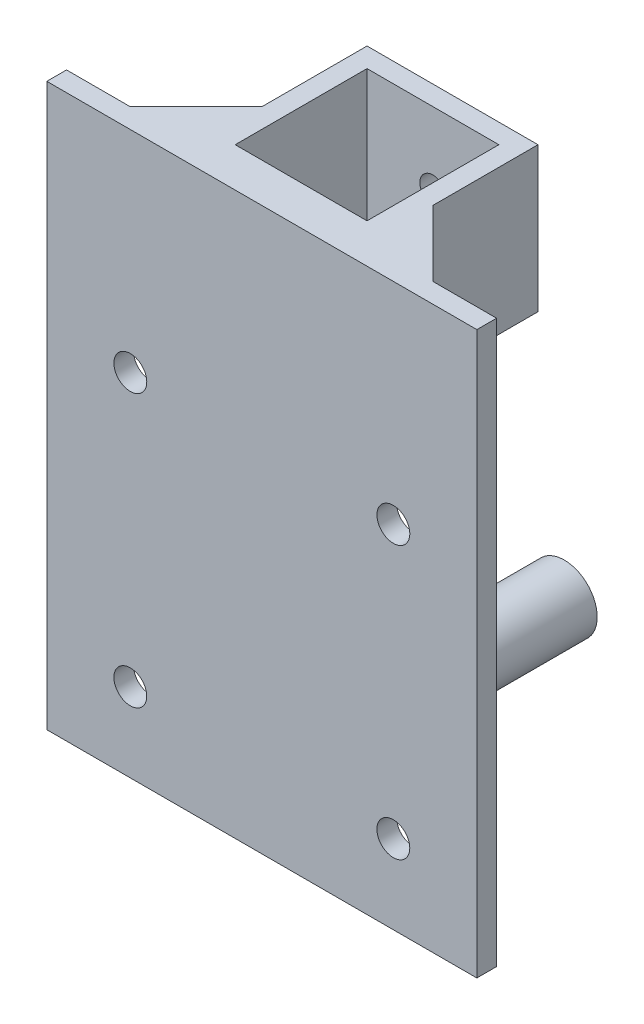
ISO-10303-21;
HEADER;
FILE_DESCRIPTION(('STEP AP214'),'2;1');
FILE_NAME('part.step','',(''),(''),'','','');
FILE_SCHEMA(('AUTOMOTIVE_DESIGN { 1 0 10303 214 1 1 1 1 }'));
ENDSEC;
DATA;
#1=APPLICATION_CONTEXT('core data for automotive mechanical design processes');
#2=APPLICATION_PROTOCOL_DEFINITION('international standard','automotive_design',2000,#1);
#3=PRODUCT_CONTEXT('',#1,'mechanical');
#4=PRODUCT('Part','Part','',(#3));
#5=PRODUCT_RELATED_PRODUCT_CATEGORY('part','',(#4));
#6=PRODUCT_DEFINITION_FORMATION('','',#4);
#7=PRODUCT_DEFINITION_CONTEXT('part definition',#1,'design');
#8=PRODUCT_DEFINITION('design','',#6,#7);
#9=PRODUCT_DEFINITION_SHAPE('','',#8);
#10=(LENGTH_UNIT() NAMED_UNIT(*) SI_UNIT(.MILLI.,.METRE.));
#11=(NAMED_UNIT(*) PLANE_ANGLE_UNIT() SI_UNIT($,.RADIAN.));
#12=(NAMED_UNIT(*) SI_UNIT($,.STERADIAN.) SOLID_ANGLE_UNIT());
#13=UNCERTAINTY_MEASURE_WITH_UNIT(LENGTH_MEASURE(1.E-05),#10,'distance_accuracy_value','');
#14=(GEOMETRIC_REPRESENTATION_CONTEXT(3) GLOBAL_UNCERTAINTY_ASSIGNED_CONTEXT((#13)) GLOBAL_UNIT_ASSIGNED_CONTEXT((#10,
#11,#12)) REPRESENTATION_CONTEXT('',''));
#15=CARTESIAN_POINT('',(0.,0.,0.));
#16=DIRECTION('',(0.,0.,1.));
#17=DIRECTION('',(1.,0.,0.));
#18=AXIS2_PLACEMENT_3D('',#15,#16,#17);
#19=CARTESIAN_POINT('',(0.,0.,0.));
#20=DIRECTION('',(0.,0.,1.));
#21=DIRECTION('',(1.,0.,0.));
#22=AXIS2_PLACEMENT_3D('',#19,#20,#21);
#23=PLANE('',#22);
#24=CARTESIAN_POINT('',(-10.7,32.7,0.));
#25=DIRECTION('',(0.,0.,1.));
#26=DIRECTION('',(1.,0.,0.));
#27=AXIS2_PLACEMENT_3D('',#24,#25,#26);
#28=CIRCLE('',#27,5.);
#29=CARTESIAN_POINT('',(-5.7,32.7,0.));
#30=VERTEX_POINT('',#29);
#31=EDGE_CURVE('E317',#30,#30,#28,.F.);
#32=ORIENTED_EDGE('',*,*,#31,.F.);
#33=EDGE_LOOP('',(#32));
#34=FACE_BOUND('',#33,.T.);
#35=CARTESIAN_POINT('',(-54.7,32.7,0.));
#36=DIRECTION('',(0.,0.,1.));
#37=DIRECTION('',(1.,0.,0.));
#38=AXIS2_PLACEMENT_3D('',#35,#36,#37);
#39=CIRCLE('',#38,5.87255145259777);
#40=CARTESIAN_POINT('',(-48.8274485474022,32.7,0.));
#41=VERTEX_POINT('',#40);
#42=EDGE_CURVE('E313',#41,#41,#39,.F.);
#43=ORIENTED_EDGE('',*,*,#42,.F.);
#44=EDGE_LOOP('',(#43));
#45=FACE_BOUND('',#44,.T.);
#46=CARTESIAN_POINT('',(-52.7,12.,0.));
#47=DIRECTION('',(0.,0.,1.));
#48=DIRECTION('',(-1.,0.,0.));
#49=AXIS2_PLACEMENT_3D('',#46,#47,#48);
#50=CIRCLE('',#49,2.5);
#51=CARTESIAN_POINT('',(-55.2,12.,0.));
#52=VERTEX_POINT('',#51);
#53=EDGE_CURVE('E238',#52,#52,#50,.T.);
#54=ORIENTED_EDGE('',*,*,#53,.T.);
#55=EDGE_LOOP('',(#54));
#56=FACE_BOUND('',#55,.T.);
#57=CARTESIAN_POINT('',(-12.7,12.,0.));
#58=DIRECTION('',(0.,0.,1.));
#59=DIRECTION('',(1.,0.,0.));
#60=AXIS2_PLACEMENT_3D('',#57,#58,#59);
#61=CIRCLE('',#60,2.5);
#62=CARTESIAN_POINT('',(-10.2,12.,0.));
#63=VERTEX_POINT('',#62);
#64=EDGE_CURVE('E243',#63,#63,#61,.T.);
#65=ORIENTED_EDGE('',*,*,#64,.T.);
#66=EDGE_LOOP('',(#65));
#67=FACE_BOUND('',#66,.T.);
#68=CARTESIAN_POINT('',(-12.7,53.4,0.));
#69=DIRECTION('',(0.,0.,1.));
#70=DIRECTION('',(-1.,0.,0.));
#71=AXIS2_PLACEMENT_3D('',#68,#69,#70);
#72=CIRCLE('',#71,2.5);
#73=CARTESIAN_POINT('',(-15.2,53.4,0.));
#74=VERTEX_POINT('',#73);
#75=EDGE_CURVE('E251',#74,#74,#72,.T.);
#76=ORIENTED_EDGE('',*,*,#75,.T.);
#77=EDGE_LOOP('',(#76));
#78=FACE_BOUND('',#77,.T.);
#79=CARTESIAN_POINT('',(-52.7,53.4,0.));
#80=DIRECTION('',(0.,0.,1.));
#81=DIRECTION('',(1.,0.,0.));
#82=AXIS2_PLACEMENT_3D('',#79,#80,#81);
#83=CIRCLE('',#82,2.5);
#84=CARTESIAN_POINT('',(-50.2,53.4,0.));
#85=VERTEX_POINT('',#84);
#86=EDGE_CURVE('E259',#85,#85,#83,.T.);
#87=ORIENTED_EDGE('',*,*,#86,.T.);
#88=EDGE_LOOP('',(#87));
#89=FACE_BOUND('',#88,.T.);
#90=DIRECTION('',(-1.,0.,0.));
#91=VECTOR('',#90,1.);
#92=CARTESIAN_POINT('',(-19.7,63.4,0.));
#93=LINE('',#92,#91);
#94=CARTESIAN_POINT('',(-9.70000000000007,63.4,0.));
#95=VERTEX_POINT('',#94);
#96=CARTESIAN_POINT('',(-55.6999999999999,63.4,0.));
#97=VERTEX_POINT('',#96);
#98=EDGE_CURVE('E65',#95,#97,#93,.T.);
#99=ORIENTED_EDGE('',*,*,#98,.F.);
#100=DIRECTION('',(0.,1.,0.));
#101=VECTOR('',#100,1.);
#102=CARTESIAN_POINT('',(-9.70000000000007,85.4,0.));
#103=LINE('',#102,#101);
#104=CARTESIAN_POINT('',(-9.70000000000007,85.4,0.));
#105=VERTEX_POINT('',#104);
#106=EDGE_CURVE('E70',#95,#105,#103,.T.);
#107=ORIENTED_EDGE('',*,*,#106,.T.);
#108=DIRECTION('',(-1.,0.,0.));
#109=VECTOR('',#108,1.);
#110=CARTESIAN_POINT('',(0.,85.4,0.));
#111=LINE('',#110,#109);
#112=CARTESIAN_POINT('',(0.,85.4,0.));
#113=VERTEX_POINT('',#112);
#114=EDGE_CURVE('E290',#113,#105,#111,.T.);
#115=ORIENTED_EDGE('',*,*,#114,.F.);
#116=DIRECTION('',(0.,1.,0.));
#117=VECTOR('',#116,1.);
#118=CARTESIAN_POINT('',(0.,0.,0.));
#119=LINE('',#118,#117);
#120=CARTESIAN_POINT('',(0.,0.,0.));
#121=VERTEX_POINT('',#120);
#122=EDGE_CURVE('E267',#121,#113,#119,.T.);
#123=ORIENTED_EDGE('',*,*,#122,.F.);
#124=DIRECTION('',(1.,0.,0.));
#125=VECTOR('',#124,1.);
#126=CARTESIAN_POINT('',(0.,0.,0.));
#127=LINE('',#126,#125);
#128=CARTESIAN_POINT('',(-65.4,0.,0.));
#129=VERTEX_POINT('',#128);
#130=EDGE_CURVE('E276',#129,#121,#127,.T.);
#131=ORIENTED_EDGE('',*,*,#130,.F.);
#132=DIRECTION('',(0.,-1.,0.));
#133=VECTOR('',#132,1.);
#134=CARTESIAN_POINT('',(-65.4,0.,0.));
#135=LINE('',#134,#133);
#136=CARTESIAN_POINT('',(-65.4,85.4,0.));
#137=VERTEX_POINT('',#136);
#138=EDGE_CURVE('E293',#137,#129,#135,.T.);
#139=ORIENTED_EDGE('',*,*,#138,.F.);
#140=CARTESIAN_POINT('',(-55.6999999999999,85.4,0.));
#141=VERTEX_POINT('',#140);
#142=EDGE_CURVE('E289',#141,#137,#111,.T.);
#143=ORIENTED_EDGE('',*,*,#142,.F.);
#144=DIRECTION('',(0.,-1.,0.));
#145=VECTOR('',#144,1.);
#146=CARTESIAN_POINT('',(-55.6999999999999,63.4,0.));
#147=LINE('',#146,#145);
#148=EDGE_CURVE('E325',#141,#97,#147,.T.);
#149=ORIENTED_EDGE('',*,*,#148,.T.);
#150=EDGE_LOOP('',(#99,#107,#115,#123,#131,#139,#143,#149));
#151=FACE_BOUND('',#150,.T.);
#152=ADVANCED_FACE('F47',(#34,#45,#56,#67,#78,#89,#151),#23,.F.);
#153=CARTESIAN_POINT('',(0.,0.,3.));
#154=DIRECTION('',(0.,0.,1.));
#155=DIRECTION('',(1.,0.,0.));
#156=AXIS2_PLACEMENT_3D('',#153,#154,#155);
#157=PLANE('',#156);
#158=CARTESIAN_POINT('',(-12.7,12.,3.));
#159=DIRECTION('',(0.,0.,1.));
#160=DIRECTION('',(1.,0.,0.));
#161=AXIS2_PLACEMENT_3D('',#158,#159,#160);
#162=CIRCLE('',#161,2.5);
#163=CARTESIAN_POINT('',(-10.2,12.,3.));
#164=VERTEX_POINT('',#163);
#165=EDGE_CURVE('E247',#164,#164,#162,.T.);
#166=ORIENTED_EDGE('',*,*,#165,.F.);
#167=EDGE_LOOP('',(#166));
#168=FACE_BOUND('',#167,.T.);
#169=CARTESIAN_POINT('',(-52.7,53.4,3.));
#170=DIRECTION('',(0.,0.,1.));
#171=DIRECTION('',(1.,0.,0.));
#172=AXIS2_PLACEMENT_3D('',#169,#170,#171);
#173=CIRCLE('',#172,2.5);
#174=CARTESIAN_POINT('',(-50.2,53.4,3.));
#175=VERTEX_POINT('',#174);
#176=EDGE_CURVE('E263',#175,#175,#173,.T.);
#177=ORIENTED_EDGE('',*,*,#176,.F.);
#178=EDGE_LOOP('',(#177));
#179=FACE_BOUND('',#178,.T.);
#180=DIRECTION('',(0.,1.,0.));
#181=VECTOR('',#180,1.);
#182=CARTESIAN_POINT('',(0.,0.,3.));
#183=LINE('',#182,#181);
#184=CARTESIAN_POINT('',(0.,0.,3.));
#185=VERTEX_POINT('',#184);
#186=CARTESIAN_POINT('',(0.,85.4,3.));
#187=VERTEX_POINT('',#186);
#188=EDGE_CURVE('E271',#185,#187,#183,.T.);
#189=ORIENTED_EDGE('',*,*,#188,.T.);
#190=DIRECTION('',(-1.,0.,0.));
#191=VECTOR('',#190,1.);
#192=CARTESIAN_POINT('',(0.,85.4,3.));
#193=LINE('',#192,#191);
#194=CARTESIAN_POINT('',(-65.4,85.4,3.));
#195=VERTEX_POINT('',#194);
#196=EDGE_CURVE('E275',#187,#195,#193,.T.);
#197=ORIENTED_EDGE('',*,*,#196,.T.);
#198=DIRECTION('',(0.,-1.,0.));
#199=VECTOR('',#198,1.);
#200=CARTESIAN_POINT('',(-65.4,0.,3.));
#201=LINE('',#200,#199);
#202=CARTESIAN_POINT('',(-65.4,0.,3.));
#203=VERTEX_POINT('',#202);
#204=EDGE_CURVE('E279',#195,#203,#201,.T.);
#205=ORIENTED_EDGE('',*,*,#204,.T.);
#206=DIRECTION('',(1.,0.,0.));
#207=VECTOR('',#206,1.);
#208=CARTESIAN_POINT('',(0.,0.,3.));
#209=LINE('',#208,#207);
#210=EDGE_CURVE('E282',#203,#185,#209,.T.);
#211=ORIENTED_EDGE('',*,*,#210,.T.);
#212=EDGE_LOOP('',(#189,#197,#205,#211));
#213=FACE_BOUND('',#212,.T.);
#214=CARTESIAN_POINT('',(-12.7,53.4,3.));
#215=DIRECTION('',(0.,0.,1.));
#216=DIRECTION('',(-1.,0.,0.));
#217=AXIS2_PLACEMENT_3D('',#214,#215,#216);
#218=CIRCLE('',#217,2.5);
#219=CARTESIAN_POINT('',(-15.2,53.4,3.));
#220=VERTEX_POINT('',#219);
#221=EDGE_CURVE('E255',#220,#220,#218,.T.);
#222=ORIENTED_EDGE('',*,*,#221,.F.);
#223=EDGE_LOOP('',(#222));
#224=FACE_BOUND('',#223,.T.);
#225=CARTESIAN_POINT('',(-52.7,12.,3.));
#226=DIRECTION('',(0.,0.,1.));
#227=DIRECTION('',(-1.,0.,0.));
#228=AXIS2_PLACEMENT_3D('',#225,#226,#227);
#229=CIRCLE('',#228,2.5);
#230=CARTESIAN_POINT('',(-55.2,12.,3.));
#231=VERTEX_POINT('',#230);
#232=EDGE_CURVE('E239',#231,#231,#229,.T.);
#233=ORIENTED_EDGE('',*,*,#232,.F.);
#234=EDGE_LOOP('',(#233));
#235=FACE_BOUND('',#234,.T.);
#236=ADVANCED_FACE('F375',(#168,#179,#213,#224,#235),#157,.T.);
#237=CARTESIAN_POINT('',(0.,0.,3.));
#238=DIRECTION('',(-1.,0.,0.));
#239=DIRECTION('',(0.,-1.,0.));
#240=AXIS2_PLACEMENT_3D('',#237,#238,#239);
#241=PLANE('',#240);
#242=ORIENTED_EDGE('',*,*,#122,.T.);
#243=DIRECTION('',(0.,0.,-1.));
#244=VECTOR('',#243,1.);
#245=CARTESIAN_POINT('',(0.,85.4,3.));
#246=LINE('',#245,#244);
#247=EDGE_CURVE('E309',#187,#113,#246,.T.);
#248=ORIENTED_EDGE('',*,*,#247,.F.);
#249=ORIENTED_EDGE('',*,*,#188,.F.);
#250=DIRECTION('',(0.,0.,-1.));
#251=VECTOR('',#250,1.);
#252=CARTESIAN_POINT('',(0.,0.,3.));
#253=LINE('',#252,#251);
#254=EDGE_CURVE('E285',#185,#121,#253,.T.);
#255=ORIENTED_EDGE('',*,*,#254,.T.);
#256=EDGE_LOOP('',(#242,#248,#249,#255));
#257=FACE_BOUND('',#256,.T.);
#258=ADVANCED_FACE('F382',(#257),#241,.F.);
#259=CARTESIAN_POINT('',(0.,85.4,3.));
#260=DIRECTION('',(0.,-1.,0.));
#261=DIRECTION('',(0.,0.,-1.));
#262=AXIS2_PLACEMENT_3D('',#259,#260,#261);
#263=PLANE('',#262);
#264=DIRECTION('',(-1.,0.,0.));
#265=VECTOR('',#264,1.);
#266=CARTESIAN_POINT('',(-42.725,85.4,-2.975));
#267=LINE('',#266,#265);
#268=CARTESIAN_POINT('',(-22.675,85.4,-2.975));
#269=VERTEX_POINT('',#268);
#270=CARTESIAN_POINT('',(-42.725,85.4,-2.975));
#271=VERTEX_POINT('',#270);
#272=EDGE_CURVE('E162',#269,#271,#267,.T.);
#273=ORIENTED_EDGE('',*,*,#272,.T.);
#274=DIRECTION('',(0.,0.,-1.));
#275=VECTOR('',#274,1.);
#276=CARTESIAN_POINT('',(-42.725,85.4,-2.975));
#277=LINE('',#276,#275);
#278=CARTESIAN_POINT('',(-42.725,85.4,-23.025));
#279=VERTEX_POINT('',#278);
#280=EDGE_CURVE('E153',#271,#279,#277,.T.);
#281=ORIENTED_EDGE('',*,*,#280,.T.);
#282=DIRECTION('',(1.,0.,0.));
#283=VECTOR('',#282,1.);
#284=CARTESIAN_POINT('',(-42.725,85.4,-23.025));
#285=LINE('',#284,#283);
#286=CARTESIAN_POINT('',(-22.675,85.4,-23.025));
#287=VERTEX_POINT('',#286);
#288=EDGE_CURVE('E166',#279,#287,#285,.T.);
#289=ORIENTED_EDGE('',*,*,#288,.T.);
#290=DIRECTION('',(0.,0.,1.));
#291=VECTOR('',#290,1.);
#292=CARTESIAN_POINT('',(-22.675,85.4,-2.975));
#293=LINE('',#292,#291);
#294=EDGE_CURVE('E171',#287,#269,#293,.T.);
#295=ORIENTED_EDGE('',*,*,#294,.T.);
#296=EDGE_LOOP('',(#273,#281,#289,#295));
#297=FACE_BOUND('',#296,.T.);
#298=ORIENTED_EDGE('',*,*,#114,.T.);
#299=DIRECTION('',(0.707106781186543,0.,0.707106781186552));
#300=VECTOR('',#299,1.);
#301=CARTESIAN_POINT('',(-3.35000000000009,85.4,6.35000000000005));
#302=LINE('',#301,#300);
#303=CARTESIAN_POINT('',(-19.7,85.4,-10.0000000000001));
#304=VERTEX_POINT('',#303);
#305=EDGE_CURVE('E11',#105,#304,#302,.F.);
#306=ORIENTED_EDGE('',*,*,#305,.T.);
#307=DIRECTION('',(0.,0.,1.));
#308=VECTOR('',#307,1.);
#309=CARTESIAN_POINT('',(-19.7,85.4,-26.));
#310=LINE('',#309,#308);
#311=CARTESIAN_POINT('',(-19.7,85.4,-26.));
#312=VERTEX_POINT('',#311);
#313=EDGE_CURVE('E220',#312,#304,#310,.T.);
#314=ORIENTED_EDGE('',*,*,#313,.F.);
#315=DIRECTION('',(1.,0.,0.));
#316=VECTOR('',#315,1.);
#317=CARTESIAN_POINT('',(-19.7,85.4,-26.));
#318=LINE('',#317,#316);
#319=CARTESIAN_POINT('',(-45.7,85.4,-26.));
#320=VERTEX_POINT('',#319);
#321=EDGE_CURVE('E217',#320,#312,#318,.T.);
#322=ORIENTED_EDGE('',*,*,#321,.F.);
#323=DIRECTION('',(0.,0.,1.));
#324=VECTOR('',#323,1.);
#325=CARTESIAN_POINT('',(-45.7,85.4,-26.));
#326=LINE('',#325,#324);
#327=CARTESIAN_POINT('',(-45.7,85.4,-10.0000000000001));
#328=VERTEX_POINT('',#327);
#329=EDGE_CURVE('E226',#320,#328,#326,.T.);
#330=ORIENTED_EDGE('',*,*,#329,.T.);
#331=DIRECTION('',(0.707106781186544,0.,-0.707106781186551));
#332=VECTOR('',#331,1.);
#333=CARTESIAN_POINT('',(-29.3500000000003,85.4,-26.3499999999999));
#334=LINE('',#333,#332);
#335=EDGE_CURVE('E328',#328,#141,#334,.F.);
#336=ORIENTED_EDGE('',*,*,#335,.T.);
#337=ORIENTED_EDGE('',*,*,#142,.T.);
#338=DIRECTION('',(0.,0.,-1.));
#339=VECTOR('',#338,1.);
#340=CARTESIAN_POINT('',(-65.4,85.4,3.));
#341=LINE('',#340,#339);
#342=EDGE_CURVE('E305',#195,#137,#341,.T.);
#343=ORIENTED_EDGE('',*,*,#342,.F.);
#344=ORIENTED_EDGE('',*,*,#196,.F.);
#345=ORIENTED_EDGE('',*,*,#247,.T.);
#346=EDGE_LOOP('',(#298,#306,#314,#322,#330,#336,#337,#343,#344,#345));
#347=FACE_BOUND('',#346,.T.);
#348=ADVANCED_FACE('F173',(#297,#347),#263,.F.);
#349=CARTESIAN_POINT('',(-65.4,0.,3.));
#350=DIRECTION('',(1.,0.,0.));
#351=DIRECTION('',(0.,0.,-1.));
#352=AXIS2_PLACEMENT_3D('',#349,#350,#351);
#353=PLANE('',#352);
#354=ORIENTED_EDGE('',*,*,#138,.T.);
#355=DIRECTION('',(0.,0.,-1.));
#356=VECTOR('',#355,1.);
#357=CARTESIAN_POINT('',(-65.4,0.,3.));
#358=LINE('',#357,#356);
#359=EDGE_CURVE('E301',#203,#129,#358,.T.);
#360=ORIENTED_EDGE('',*,*,#359,.F.);
#361=ORIENTED_EDGE('',*,*,#204,.F.);
#362=ORIENTED_EDGE('',*,*,#342,.T.);
#363=EDGE_LOOP('',(#354,#360,#361,#362));
#364=FACE_BOUND('',#363,.T.);
#365=ADVANCED_FACE('F371',(#364),#353,.F.);
#366=CARTESIAN_POINT('',(0.,0.,3.));
#367=DIRECTION('',(0.,1.,0.));
#368=DIRECTION('',(-1.,0.,0.));
#369=AXIS2_PLACEMENT_3D('',#366,#367,#368);
#370=PLANE('',#369);
#371=ORIENTED_EDGE('',*,*,#130,.T.);
#372=ORIENTED_EDGE('',*,*,#254,.F.);
#373=ORIENTED_EDGE('',*,*,#210,.F.);
#374=ORIENTED_EDGE('',*,*,#359,.T.);
#375=EDGE_LOOP('',(#371,#372,#373,#374));
#376=FACE_BOUND('',#375,.T.);
#377=ADVANCED_FACE('F384',(#376),#370,.F.);
#378=CARTESIAN_POINT('',(-52.7,53.4,3.));
#379=DIRECTION('',(0.,0.,-1.));
#380=DIRECTION('',(-1.,0.,0.));
#381=AXIS2_PLACEMENT_3D('',#378,#379,#380);
#382=CYLINDRICAL_SURFACE('',#381,2.5);
#383=ORIENTED_EDGE('',*,*,#176,.T.);
#384=EDGE_LOOP('',(#383));
#385=FACE_BOUND('',#384,.T.);
#386=ORIENTED_EDGE('',*,*,#86,.F.);
#387=EDGE_LOOP('',(#386));
#388=FACE_BOUND('',#387,.T.);
#389=ADVANCED_FACE('F386',(#385,#388),#382,.F.);
#390=CARTESIAN_POINT('',(-12.7,53.4,3.));
#391=DIRECTION('',(0.,0.,-1.));
#392=DIRECTION('',(-1.,0.,0.));
#393=AXIS2_PLACEMENT_3D('',#390,#391,#392);
#394=CYLINDRICAL_SURFACE('',#393,2.5);
#395=ORIENTED_EDGE('',*,*,#221,.T.);
#396=EDGE_LOOP('',(#395));
#397=FACE_BOUND('',#396,.T.);
#398=ORIENTED_EDGE('',*,*,#75,.F.);
#399=EDGE_LOOP('',(#398));
#400=FACE_BOUND('',#399,.T.);
#401=ADVANCED_FACE('F392',(#397,#400),#394,.F.);
#402=CARTESIAN_POINT('',(-12.7,12.,3.));
#403=DIRECTION('',(0.,0.,-1.));
#404=DIRECTION('',(-1.,0.,0.));
#405=AXIS2_PLACEMENT_3D('',#402,#403,#404);
#406=CYLINDRICAL_SURFACE('',#405,2.5);
#407=ORIENTED_EDGE('',*,*,#165,.T.);
#408=EDGE_LOOP('',(#407));
#409=FACE_BOUND('',#408,.T.);
#410=ORIENTED_EDGE('',*,*,#64,.F.);
#411=EDGE_LOOP('',(#410));
#412=FACE_BOUND('',#411,.T.);
#413=ADVANCED_FACE('F411',(#409,#412),#406,.F.);
#414=CARTESIAN_POINT('',(-52.7,12.,3.));
#415=DIRECTION('',(0.,0.,-1.));
#416=DIRECTION('',(-1.,0.,0.));
#417=AXIS2_PLACEMENT_3D('',#414,#415,#416);
#418=CYLINDRICAL_SURFACE('',#417,2.5);
#419=ORIENTED_EDGE('',*,*,#232,.T.);
#420=EDGE_LOOP('',(#419));
#421=FACE_BOUND('',#420,.T.);
#422=ORIENTED_EDGE('',*,*,#53,.F.);
#423=EDGE_LOOP('',(#422));
#424=FACE_BOUND('',#423,.T.);
#425=ADVANCED_FACE('F415',(#421,#424),#418,.F.);
#426=CARTESIAN_POINT('',(-19.7,85.4,-26.));
#427=DIRECTION('',(-1.,0.,0.));
#428=DIRECTION('',(0.,-1.,0.));
#429=AXIS2_PLACEMENT_3D('',#426,#427,#428);
#430=PLANE('',#429);
#431=ORIENTED_EDGE('',*,*,#313,.T.);
#432=DIRECTION('',(0.,-1.,0.));
#433=VECTOR('',#432,1.);
#434=CARTESIAN_POINT('',(-19.7,63.4,-10.));
#435=LINE('',#434,#433);
#436=CARTESIAN_POINT('',(-19.7,63.4,-10.0000000000001));
#437=VERTEX_POINT('',#436);
#438=EDGE_CURVE('E334',#304,#437,#435,.T.);
#439=ORIENTED_EDGE('',*,*,#438,.T.);
#440=DIRECTION('',(0.,0.,1.));
#441=VECTOR('',#440,1.);
#442=CARTESIAN_POINT('',(-19.7,63.4,-26.));
#443=LINE('',#442,#441);
#444=CARTESIAN_POINT('',(-19.7,63.4,-26.));
#445=VERTEX_POINT('',#444);
#446=EDGE_CURVE('E234',#445,#437,#443,.T.);
#447=ORIENTED_EDGE('',*,*,#446,.F.);
#448=DIRECTION('',(0.,-1.,0.));
#449=VECTOR('',#448,1.);
#450=CARTESIAN_POINT('',(-19.7,85.4,-26.));
#451=LINE('',#450,#449);
#452=EDGE_CURVE('E207',#312,#445,#451,.T.);
#453=ORIENTED_EDGE('',*,*,#452,.F.);
#454=EDGE_LOOP('',(#431,#439,#447,#453));
#455=FACE_BOUND('',#454,.T.);
#456=ADVANCED_FACE('F351',(#455),#430,.F.);
#457=CARTESIAN_POINT('',(-19.7,63.4,-26.));
#458=DIRECTION('',(0.,1.,0.));
#459=DIRECTION('',(0.,0.,1.));
#460=AXIS2_PLACEMENT_3D('',#457,#458,#459);
#461=PLANE('',#460);
#462=DIRECTION('',(1.,0.,0.));
#463=VECTOR('',#462,1.);
#464=CARTESIAN_POINT('',(-42.725,63.4,-23.025));
#465=LINE('',#464,#463);
#466=CARTESIAN_POINT('',(-42.725,63.4,-23.025));
#467=VERTEX_POINT('',#466);
#468=CARTESIAN_POINT('',(-22.675,63.4,-23.025));
#469=VERTEX_POINT('',#468);
#470=EDGE_CURVE('E193',#467,#469,#465,.T.);
#471=ORIENTED_EDGE('',*,*,#470,.F.);
#472=DIRECTION('',(0.,0.,-1.));
#473=VECTOR('',#472,1.);
#474=CARTESIAN_POINT('',(-42.725,63.4,-2.975));
#475=LINE('',#474,#473);
#476=CARTESIAN_POINT('',(-42.725,63.4,-2.975));
#477=VERTEX_POINT('',#476);
#478=EDGE_CURVE('E156',#477,#467,#475,.T.);
#479=ORIENTED_EDGE('',*,*,#478,.F.);
#480=DIRECTION('',(-1.,0.,0.));
#481=VECTOR('',#480,1.);
#482=CARTESIAN_POINT('',(-42.725,63.4,-2.975));
#483=LINE('',#482,#481);
#484=CARTESIAN_POINT('',(-22.675,63.4,-2.975));
#485=VERTEX_POINT('',#484);
#486=EDGE_CURVE('E177',#485,#477,#483,.T.);
#487=ORIENTED_EDGE('',*,*,#486,.F.);
#488=DIRECTION('',(0.,0.,1.));
#489=VECTOR('',#488,1.);
#490=CARTESIAN_POINT('',(-22.675,63.4,-2.975));
#491=LINE('',#490,#489);
#492=EDGE_CURVE('E181',#469,#485,#491,.T.);
#493=ORIENTED_EDGE('',*,*,#492,.F.);
#494=EDGE_LOOP('',(#471,#479,#487,#493));
#495=FACE_BOUND('',#494,.T.);
#496=ORIENTED_EDGE('',*,*,#98,.T.);
#497=DIRECTION('',(-0.707106781186544,0.,0.707106781186551));
#498=VECTOR('',#497,1.);
#499=CARTESIAN_POINT('',(-24.7000000000002,63.4,-31.0000000000001));
#500=LINE('',#499,#498);
#501=CARTESIAN_POINT('',(-45.7,63.4,-10.0000000000001));
#502=VERTEX_POINT('',#501);
#503=EDGE_CURVE('E331',#97,#502,#500,.F.);
#504=ORIENTED_EDGE('',*,*,#503,.T.);
#505=DIRECTION('',(0.,0.,1.));
#506=VECTOR('',#505,1.);
#507=CARTESIAN_POINT('',(-45.7,63.4,-26.));
#508=LINE('',#507,#506);
#509=CARTESIAN_POINT('',(-45.7,63.4,-26.));
#510=VERTEX_POINT('',#509);
#511=EDGE_CURVE('E230',#510,#502,#508,.T.);
#512=ORIENTED_EDGE('',*,*,#511,.F.);
#513=DIRECTION('',(-1.,0.,0.));
#514=VECTOR('',#513,1.);
#515=CARTESIAN_POINT('',(-19.7,63.4,-26.));
#516=LINE('',#515,#514);
#517=EDGE_CURVE('E211',#445,#510,#516,.T.);
#518=ORIENTED_EDGE('',*,*,#517,.F.);
#519=ORIENTED_EDGE('',*,*,#446,.T.);
#520=DIRECTION('',(-0.707106781186543,0.,-0.707106781186552));
#521=VECTOR('',#520,1.);
#522=CARTESIAN_POINT('',(-27.7,63.4,-18.0000000000001));
#523=LINE('',#522,#521);
#524=EDGE_CURVE('E58',#437,#95,#523,.F.);
#525=ORIENTED_EDGE('',*,*,#524,.T.);
#526=EDGE_LOOP('',(#496,#504,#512,#518,#519,#525));
#527=FACE_BOUND('',#526,.T.);
#528=ADVANCED_FACE('F342',(#495,#527),#461,.F.);
#529=CARTESIAN_POINT('',(-45.7,85.4,-26.));
#530=DIRECTION('',(1.,0.,0.));
#531=DIRECTION('',(0.,1.,0.));
#532=AXIS2_PLACEMENT_3D('',#529,#530,#531);
#533=PLANE('',#532);
#534=ORIENTED_EDGE('',*,*,#511,.T.);
#535=DIRECTION('',(0.,1.,0.));
#536=VECTOR('',#535,1.);
#537=CARTESIAN_POINT('',(-45.7,85.4,-10.));
#538=LINE('',#537,#536);
#539=EDGE_CURVE('E321',#502,#328,#538,.T.);
#540=ORIENTED_EDGE('',*,*,#539,.T.);
#541=ORIENTED_EDGE('',*,*,#329,.F.);
#542=DIRECTION('',(0.,1.,0.));
#543=VECTOR('',#542,1.);
#544=CARTESIAN_POINT('',(-45.7,85.4,-26.));
#545=LINE('',#544,#543);
#546=EDGE_CURVE('E214',#510,#320,#545,.T.);
#547=ORIENTED_EDGE('',*,*,#546,.F.);
#548=EDGE_LOOP('',(#534,#540,#541,#547));
#549=FACE_BOUND('',#548,.T.);
#550=ADVANCED_FACE('F359',(#549),#533,.F.);
#551=CARTESIAN_POINT('',(0.,0.,-26.));
#552=DIRECTION('',(0.,0.,-1.));
#553=DIRECTION('',(-1.,0.,0.));
#554=AXIS2_PLACEMENT_3D('',#551,#552,#553);
#555=PLANE('',#554);
#556=CARTESIAN_POINT('',(-32.7,74.4,-26.));
#557=DIRECTION('',(0.,0.,-1.));
#558=DIRECTION('',(-1.,0.,0.));
#559=AXIS2_PLACEMENT_3D('',#556,#557,#558);
#560=CIRCLE('',#559,2.);
#561=CARTESIAN_POINT('',(-34.7,74.4,-26.));
#562=VERTEX_POINT('',#561);
#563=EDGE_CURVE('E484',#562,#562,#560,.T.);
#564=ORIENTED_EDGE('',*,*,#563,.F.);
#565=EDGE_LOOP('',(#564));
#566=FACE_BOUND('',#565,.T.);
#567=ORIENTED_EDGE('',*,*,#452,.T.);
#568=ORIENTED_EDGE('',*,*,#517,.T.);
#569=ORIENTED_EDGE('',*,*,#546,.T.);
#570=ORIENTED_EDGE('',*,*,#321,.T.);
#571=EDGE_LOOP('',(#567,#568,#569,#570));
#572=FACE_BOUND('',#571,.T.);
#573=ADVANCED_FACE('F353',(#566,#572),#555,.T.);
#574=CARTESIAN_POINT('',(-42.725,85.4,-2.975));
#575=DIRECTION('',(-1.,0.,0.));
#576=DIRECTION('',(0.,0.,1.));
#577=AXIS2_PLACEMENT_3D('',#574,#575,#576);
#578=PLANE('',#577);
#579=ORIENTED_EDGE('',*,*,#478,.T.);
#580=DIRECTION('',(0.,-1.,0.));
#581=VECTOR('',#580,1.);
#582=CARTESIAN_POINT('',(-42.725,85.4,-23.025));
#583=LINE('',#582,#581);
#584=EDGE_CURVE('E149',#279,#467,#583,.T.);
#585=ORIENTED_EDGE('',*,*,#584,.F.);
#586=ORIENTED_EDGE('',*,*,#280,.F.);
#587=DIRECTION('',(0.,-1.,0.));
#588=VECTOR('',#587,1.);
#589=CARTESIAN_POINT('',(-42.725,85.4,-2.975));
#590=LINE('',#589,#588);
#591=EDGE_CURVE('E199',#271,#477,#590,.T.);
#592=ORIENTED_EDGE('',*,*,#591,.T.);
#593=EDGE_LOOP('',(#579,#585,#586,#592));
#594=FACE_BOUND('',#593,.T.);
#595=ADVANCED_FACE('F151',(#594),#578,.F.);
#596=CARTESIAN_POINT('',(-42.725,85.4,-2.975));
#597=DIRECTION('',(0.,0.,1.));
#598=DIRECTION('',(1.,0.,0.));
#599=AXIS2_PLACEMENT_3D('',#596,#597,#598);
#600=PLANE('',#599);
#601=ORIENTED_EDGE('',*,*,#486,.T.);
#602=ORIENTED_EDGE('',*,*,#591,.F.);
#603=ORIENTED_EDGE('',*,*,#272,.F.);
#604=DIRECTION('',(0.,-1.,0.));
#605=VECTOR('',#604,1.);
#606=CARTESIAN_POINT('',(-22.675,85.4,-2.975));
#607=LINE('',#606,#605);
#608=EDGE_CURVE('E202',#269,#485,#607,.T.);
#609=ORIENTED_EDGE('',*,*,#608,.T.);
#610=EDGE_LOOP('',(#601,#602,#603,#609));
#611=FACE_BOUND('',#610,.T.);
#612=ADVANCED_FACE('F432',(#611),#600,.F.);
#613=CARTESIAN_POINT('',(-22.675,85.4,-2.975));
#614=DIRECTION('',(1.,0.,0.));
#615=DIRECTION('',(0.,1.,0.));
#616=AXIS2_PLACEMENT_3D('',#613,#614,#615);
#617=PLANE('',#616);
#618=ORIENTED_EDGE('',*,*,#492,.T.);
#619=ORIENTED_EDGE('',*,*,#608,.F.);
#620=ORIENTED_EDGE('',*,*,#294,.F.);
#621=DIRECTION('',(0.,-1.,0.));
#622=VECTOR('',#621,1.);
#623=CARTESIAN_POINT('',(-22.675,85.4,-23.025));
#624=LINE('',#623,#622);
#625=EDGE_CURVE('E161',#287,#469,#624,.T.);
#626=ORIENTED_EDGE('',*,*,#625,.T.);
#627=EDGE_LOOP('',(#618,#619,#620,#626));
#628=FACE_BOUND('',#627,.T.);
#629=ADVANCED_FACE('F436',(#628),#617,.F.);
#630=CARTESIAN_POINT('',(-42.725,85.4,-23.025));
#631=DIRECTION('',(0.,0.,-1.));
#632=DIRECTION('',(-1.,0.,0.));
#633=AXIS2_PLACEMENT_3D('',#630,#631,#632);
#634=PLANE('',#633);
#635=CARTESIAN_POINT('',(-32.7,74.4,-23.025));
#636=DIRECTION('',(0.,0.,-1.));
#637=DIRECTION('',(-1.,0.,0.));
#638=AXIS2_PLACEMENT_3D('',#635,#636,#637);
#639=CIRCLE('',#638,2.);
#640=CARTESIAN_POINT('',(-34.7,74.4,-23.025));
#641=VERTEX_POINT('',#640);
#642=EDGE_CURVE('E52',#641,#641,#639,.T.);
#643=ORIENTED_EDGE('',*,*,#642,.T.);
#644=EDGE_LOOP('',(#643));
#645=FACE_BOUND('',#644,.T.);
#646=ORIENTED_EDGE('',*,*,#470,.T.);
#647=ORIENTED_EDGE('',*,*,#625,.F.);
#648=ORIENTED_EDGE('',*,*,#288,.F.);
#649=ORIENTED_EDGE('',*,*,#584,.T.);
#650=EDGE_LOOP('',(#646,#647,#648,#649));
#651=FACE_BOUND('',#650,.T.);
#652=ADVANCED_FACE('F167',(#645,#651),#634,.F.);
#653=CARTESIAN_POINT('',(-54.7,32.7,-14.4));
#654=DIRECTION('',(0.,0.,1.));
#655=DIRECTION('',(1.,0.,0.));
#656=AXIS2_PLACEMENT_3D('',#653,#654,#655);
#657=CYLINDRICAL_SURFACE('',#656,5.87255145259777);
#658=CARTESIAN_POINT('',(-54.7,32.7,-14.4));
#659=DIRECTION('',(0.,0.,-1.));
#660=DIRECTION('',(-1.,0.,0.));
#661=AXIS2_PLACEMENT_3D('',#658,#659,#660);
#662=CIRCLE('',#661,5.87255145259777);
#663=CARTESIAN_POINT('',(-60.5725514525978,32.7,-14.4));
#664=VERTEX_POINT('',#663);
#665=EDGE_CURVE('E184',#664,#664,#662,.T.);
#666=ORIENTED_EDGE('',*,*,#665,.F.);
#667=EDGE_LOOP('',(#666));
#668=FACE_BOUND('',#667,.T.);
#669=ORIENTED_EDGE('',*,*,#42,.T.);
#670=EDGE_LOOP('',(#669));
#671=FACE_BOUND('',#670,.T.);
#672=ADVANCED_FACE('F435',(#668,#671),#657,.T.);
#673=CARTESIAN_POINT('',(-54.7,32.7,-14.4));
#674=DIRECTION('',(0.,0.,-1.));
#675=DIRECTION('',(-1.,0.,0.));
#676=AXIS2_PLACEMENT_3D('',#673,#674,#675);
#677=PLANE('',#676);
#678=CARTESIAN_POINT('',(-54.7,32.7,-14.4));
#679=DIRECTION('',(0.,0.,-1.));
#680=DIRECTION('',(-1.,0.,0.));
#681=AXIS2_PLACEMENT_3D('',#678,#679,#680);
#682=CIRCLE('',#681,2.);
#683=CARTESIAN_POINT('',(-56.7,32.7,-14.4));
#684=VERTEX_POINT('',#683);
#685=EDGE_CURVE('E488',#684,#684,#682,.T.);
#686=ORIENTED_EDGE('',*,*,#685,.F.);
#687=EDGE_LOOP('',(#686));
#688=FACE_BOUND('',#687,.T.);
#689=ORIENTED_EDGE('',*,*,#665,.T.);
#690=EDGE_LOOP('',(#689));
#691=FACE_BOUND('',#690,.T.);
#692=ADVANCED_FACE('F446',(#688,#691),#677,.T.);
#693=CARTESIAN_POINT('',(-10.7,32.7,-21.));
#694=DIRECTION('',(0.,0.,1.));
#695=DIRECTION('',(1.,0.,0.));
#696=AXIS2_PLACEMENT_3D('',#693,#694,#695);
#697=CYLINDRICAL_SURFACE('',#696,5.);
#698=CARTESIAN_POINT('',(-10.7,32.7,-21.));
#699=DIRECTION('',(0.,0.,-1.));
#700=DIRECTION('',(-1.,0.,0.));
#701=AXIS2_PLACEMENT_3D('',#698,#699,#700);
#702=CIRCLE('',#701,5.);
#703=CARTESIAN_POINT('',(-5.7,32.7,-21.));
#704=VERTEX_POINT('',#703);
#705=EDGE_CURVE('E504',#704,#704,#702,.T.);
#706=CARTESIAN_POINT('',(-5.7,32.7,-21.));
#707=CARTESIAN_POINT('',(-5.7,32.7,-20.78125));
#708=CARTESIAN_POINT('',(-5.7,32.7,-20.5625));
#709=CARTESIAN_POINT('',(-5.7,32.7,-20.125));
#710=CARTESIAN_POINT('',(-5.7,32.7,-19.90625));
#711=CARTESIAN_POINT('',(-5.7,32.7,-19.46875));
#712=CARTESIAN_POINT('',(-5.7,32.7,-19.25));
#713=CARTESIAN_POINT('',(-5.7,32.7,-18.8125));
#714=CARTESIAN_POINT('',(-5.7,32.7,-18.59375));
#715=CARTESIAN_POINT('',(-5.7,32.7,-18.15625));
#716=CARTESIAN_POINT('',(-5.7,32.7,-17.9375));
#717=CARTESIAN_POINT('',(-5.7,32.7,-17.5));
#718=CARTESIAN_POINT('',(-5.7,32.7,-17.28125));
#719=CARTESIAN_POINT('',(-5.7,32.7,-16.84375));
#720=CARTESIAN_POINT('',(-5.7,32.7,-16.625));
#721=CARTESIAN_POINT('',(-5.7,32.7,-16.1875));
#722=CARTESIAN_POINT('',(-5.7,32.7,-15.96875));
#723=CARTESIAN_POINT('',(-5.7,32.7,-15.53125));
#724=CARTESIAN_POINT('',(-5.7,32.7,-15.3125));
#725=CARTESIAN_POINT('',(-5.7,32.7,-14.875));
#726=CARTESIAN_POINT('',(-5.7,32.7,-14.65625));
#727=CARTESIAN_POINT('',(-5.7,32.7,-14.21875));
#728=CARTESIAN_POINT('',(-5.7,32.7,-14.));
#729=CARTESIAN_POINT('',(-5.7,32.7,-13.5625));
#730=CARTESIAN_POINT('',(-5.7,32.7,-13.34375));
#731=CARTESIAN_POINT('',(-5.7,32.7,-12.90625));
#732=CARTESIAN_POINT('',(-5.7,32.7,-12.6875));
#733=CARTESIAN_POINT('',(-5.7,32.7,-12.25));
#734=CARTESIAN_POINT('',(-5.7,32.7,-12.03125));
#735=CARTESIAN_POINT('',(-5.7,32.7,-11.59375));
#736=CARTESIAN_POINT('',(-5.7,32.7,-11.375));
#737=CARTESIAN_POINT('',(-5.7,32.7,-10.9375));
#738=CARTESIAN_POINT('',(-5.7,32.7,-10.71875));
#739=CARTESIAN_POINT('',(-5.7,32.7,-10.28125));
#740=CARTESIAN_POINT('',(-5.7,32.7,-10.0625));
#741=CARTESIAN_POINT('',(-5.7,32.7,-9.625));
#742=CARTESIAN_POINT('',(-5.7,32.7,-9.40625));
#743=CARTESIAN_POINT('',(-5.7,32.7,-8.96875));
#744=CARTESIAN_POINT('',(-5.7,32.7,-8.75));
#745=CARTESIAN_POINT('',(-5.7,32.7,-8.3125));
#746=CARTESIAN_POINT('',(-5.7,32.7,-8.09375));
#747=CARTESIAN_POINT('',(-5.7,32.7,-7.65625));
#748=CARTESIAN_POINT('',(-5.7,32.7,-7.4375));
#749=CARTESIAN_POINT('',(-5.7,32.7,-7.));
#750=CARTESIAN_POINT('',(-5.7,32.7,-6.78125));
#751=CARTESIAN_POINT('',(-5.7,32.7,-6.34375));
#752=CARTESIAN_POINT('',(-5.7,32.7,-6.125));
#753=CARTESIAN_POINT('',(-5.7,32.7,-5.6875));
#754=CARTESIAN_POINT('',(-5.7,32.7,-5.46875));
#755=CARTESIAN_POINT('',(-5.7,32.7,-5.03125));
#756=CARTESIAN_POINT('',(-5.7,32.7,-4.8125));
#757=CARTESIAN_POINT('',(-5.7,32.7,-4.375));
#758=CARTESIAN_POINT('',(-5.7,32.7,-4.15625));
#759=CARTESIAN_POINT('',(-5.7,32.7,-3.71875));
#760=CARTESIAN_POINT('',(-5.7,32.7,-3.5));
#761=CARTESIAN_POINT('',(-5.7,32.7,-3.0625));
#762=CARTESIAN_POINT('',(-5.7,32.7,-2.84375));
#763=CARTESIAN_POINT('',(-5.7,32.7,-2.40625));
#764=CARTESIAN_POINT('',(-5.7,32.7,-2.1875));
#765=CARTESIAN_POINT('',(-5.7,32.7,-1.75));
#766=CARTESIAN_POINT('',(-5.7,32.7,-1.53125));
#767=CARTESIAN_POINT('',(-5.7,32.7,-1.09375));
#768=CARTESIAN_POINT('',(-5.7,32.7,-0.875000000000001));
#769=CARTESIAN_POINT('',(-5.7,32.7,-0.4375));
#770=CARTESIAN_POINT('',(-5.7,32.7,-0.21875));
#771=CARTESIAN_POINT('',(-5.7,32.7,0.));
#772=B_SPLINE_CURVE_WITH_KNOTS('',3,(#706,#707,#708,#709,#710,#711,#712,#713,#714,#715,#716,
#717,#718,#719,#720,#721,#722,#723,#724,#725,#726,#727,#728,#729,#730,#731,#732,#733,#734,#735,
#736,#737,#738,#739,#740,#741,#742,#743,#744,#745,#746,#747,#748,#749,#750,#751,#752,#753,#754,
#755,#756,#757,#758,#759,#760,#761,#762,#763,#764,#765,#766,#767,#768,#769,#770,#771),
.UNSPECIFIED.,.F.,.F.,(4,2,2,2,2,2,2,2,2,2,2,2,2,2,2,2,2,2,2,2,2,2,2,2,2,2,2,2,2,2,2,2,4),(0.,
0.656250000000001,1.3125,1.96875,2.625,3.28125,3.9375,4.59375,5.25,5.90625,6.5625,7.21875,7.875,
8.53125,9.1875,9.84375,10.5,11.15625,11.8125,12.46875,13.125,13.78125,14.4375,15.09375,15.75,
16.40625,17.0625,17.71875,18.375,19.03125,19.6875,20.34375,21.),.UNSPECIFIED.);
#773=EDGE_CURVE('BSEAM450',#704,#30,#772,.T.);
#774=ORIENTED_EDGE('',*,*,#705,.F.);
#775=ORIENTED_EDGE('',*,*,#31,.T.);
#776=ORIENTED_EDGE('',*,*,#773,.T.);
#777=ORIENTED_EDGE('',*,*,#773,.F.);
#778=EDGE_LOOP('',(#774,#776,#775,#777));
#779=FACE_BOUND('',#778,.T.);
#780=ADVANCED_FACE('F450',(#779),#697,.T.);
#781=CARTESIAN_POINT('',(-10.7,32.7,-21.));
#782=DIRECTION('',(0.,0.,-1.));
#783=DIRECTION('',(-1.,0.,0.));
#784=AXIS2_PLACEMENT_3D('',#781,#782,#783);
#785=PLANE('',#784);
#786=CARTESIAN_POINT('',(-10.7,32.7,-21.));
#787=DIRECTION('',(0.,0.,-1.));
#788=DIRECTION('',(-1.,0.,0.));
#789=AXIS2_PLACEMENT_3D('',#786,#787,#788);
#790=CIRCLE('',#789,2.);
#791=CARTESIAN_POINT('',(-12.7,32.7,-21.));
#792=VERTEX_POINT('',#791);
#793=EDGE_CURVE('E498',#792,#792,#790,.T.);
#794=ORIENTED_EDGE('',*,*,#793,.F.);
#795=EDGE_LOOP('',(#794));
#796=FACE_BOUND('',#795,.T.);
#797=ORIENTED_EDGE('',*,*,#705,.T.);
#798=EDGE_LOOP('',(#797));
#799=FACE_BOUND('',#798,.T.);
#800=ADVANCED_FACE('F454',(#796,#799),#785,.T.);
#801=CARTESIAN_POINT('',(-10.7,32.7,-14.4));
#802=DIRECTION('',(0.,0.,-1.));
#803=DIRECTION('',(-1.,0.,0.));
#804=AXIS2_PLACEMENT_3D('',#801,#802,#803);
#805=CYLINDRICAL_SURFACE('',#804,2.);
#806=CARTESIAN_POINT('',(-10.7,32.7,-14.4));
#807=DIRECTION('',(0.,0.,-1.));
#808=DIRECTION('',(-1.,0.,0.));
#809=AXIS2_PLACEMENT_3D('',#806,#807,#808);
#810=CIRCLE('',#809,2.);
#811=CARTESIAN_POINT('',(-12.7,32.7,-14.4));
#812=VERTEX_POINT('',#811);
#813=EDGE_CURVE('E500',#812,#812,#810,.T.);
#814=ORIENTED_EDGE('',*,*,#813,.F.);
#815=EDGE_LOOP('',(#814));
#816=FACE_BOUND('',#815,.T.);
#817=ORIENTED_EDGE('',*,*,#793,.T.);
#818=EDGE_LOOP('',(#817));
#819=FACE_BOUND('',#818,.T.);
#820=ADVANCED_FACE('F458',(#816,#819),#805,.F.);
#821=CARTESIAN_POINT('',(-10.7,32.7,-14.4));
#822=DIRECTION('',(0.,0.,-1.));
#823=DIRECTION('',(-1.,0.,0.));
#824=AXIS2_PLACEMENT_3D('',#821,#822,#823);
#825=PLANE('',#824);
#826=ORIENTED_EDGE('',*,*,#813,.T.);
#827=EDGE_LOOP('',(#826));
#828=FACE_BOUND('',#827,.T.);
#829=ADVANCED_FACE('F462',(#828),#825,.T.);
#830=CARTESIAN_POINT('',(-54.7,32.7,-6.4));
#831=DIRECTION('',(0.,0.,-1.));
#832=DIRECTION('',(-1.,0.,0.));
#833=AXIS2_PLACEMENT_3D('',#830,#831,#832);
#834=CYLINDRICAL_SURFACE('',#833,2.);
#835=CARTESIAN_POINT('',(-54.7,32.7,-6.4));
#836=DIRECTION('',(0.,0.,-1.));
#837=DIRECTION('',(-1.,0.,0.));
#838=AXIS2_PLACEMENT_3D('',#835,#836,#837);
#839=CIRCLE('',#838,2.);
#840=CARTESIAN_POINT('',(-56.7,32.7,-6.4));
#841=VERTEX_POINT('',#840);
#842=EDGE_CURVE('E492',#841,#841,#839,.T.);
#843=ORIENTED_EDGE('',*,*,#842,.F.);
#844=EDGE_LOOP('',(#843));
#845=FACE_BOUND('',#844,.T.);
#846=ORIENTED_EDGE('',*,*,#685,.T.);
#847=EDGE_LOOP('',(#846));
#848=FACE_BOUND('',#847,.T.);
#849=ADVANCED_FACE('F466',(#845,#848),#834,.F.);
#850=CARTESIAN_POINT('',(-54.7,32.7,-6.4));
#851=DIRECTION('',(0.,0.,-1.));
#852=DIRECTION('',(-1.,0.,0.));
#853=AXIS2_PLACEMENT_3D('',#850,#851,#852);
#854=PLANE('',#853);
#855=ORIENTED_EDGE('',*,*,#842,.T.);
#856=EDGE_LOOP('',(#855));
#857=FACE_BOUND('',#856,.T.);
#858=ADVANCED_FACE('F470',(#857),#854,.T.);
#859=CARTESIAN_POINT('',(-45.7,85.4,-10.));
#860=DIRECTION('',(-0.707106781186551,0.,-0.707106781186544));
#861=DIRECTION('',(0.,-1.,0.));
#862=AXIS2_PLACEMENT_3D('',#859,#860,#861);
#863=PLANE('',#862);
#864=ORIENTED_EDGE('',*,*,#503,.F.);
#865=ORIENTED_EDGE('',*,*,#148,.F.);
#866=ORIENTED_EDGE('',*,*,#335,.F.);
#867=ORIENTED_EDGE('',*,*,#539,.F.);
#868=EDGE_LOOP('',(#864,#865,#866,#867));
#869=FACE_BOUND('',#868,.T.);
#870=ADVANCED_FACE('F363',(#869),#863,.T.);
#871=CARTESIAN_POINT('',(-19.7,85.4,-10.));
#872=DIRECTION('',(0.707106781186552,0.,-0.707106781186543));
#873=DIRECTION('',(0.,1.,0.));
#874=AXIS2_PLACEMENT_3D('',#871,#872,#873);
#875=PLANE('',#874);
#876=ORIENTED_EDGE('',*,*,#305,.F.);
#877=ORIENTED_EDGE('',*,*,#106,.F.);
#878=ORIENTED_EDGE('',*,*,#524,.F.);
#879=ORIENTED_EDGE('',*,*,#438,.F.);
#880=EDGE_LOOP('',(#876,#877,#878,#879));
#881=FACE_BOUND('',#880,.T.);
#882=ADVANCED_FACE('F50',(#881),#875,.T.);
#883=CARTESIAN_POINT('',(-32.7,74.4,-18.));
#884=DIRECTION('',(0.,0.,-1.));
#885=DIRECTION('',(-1.,0.,0.));
#886=AXIS2_PLACEMENT_3D('',#883,#884,#885);
#887=CYLINDRICAL_SURFACE('',#886,2.);
#888=ORIENTED_EDGE('',*,*,#563,.T.);
#889=EDGE_LOOP('',(#888));
#890=FACE_BOUND('',#889,.T.);
#891=ORIENTED_EDGE('',*,*,#642,.F.);
#892=EDGE_LOOP('',(#891));
#893=FACE_BOUND('',#892,.T.);
#894=ADVANCED_FACE('F475',(#890,#893),#887,.F.);
#895=CLOSED_SHELL('',(#152,#236,#258,#348,#365,#377,#389,#401,#413,#425,#456,#528,#550,#573,
#595,#612,#629,#652,#672,#692,#780,#800,#820,#829,#849,#858,#870,#882,#894));
#896=MANIFOLD_SOLID_BREP('B2',#895);
#897=ADVANCED_BREP_SHAPE_REPRESENTATION('',(#18,#896),#14);
#898=SHAPE_DEFINITION_REPRESENTATION(#9,#897);
ENDSEC;
END-ISO-10303-21;
